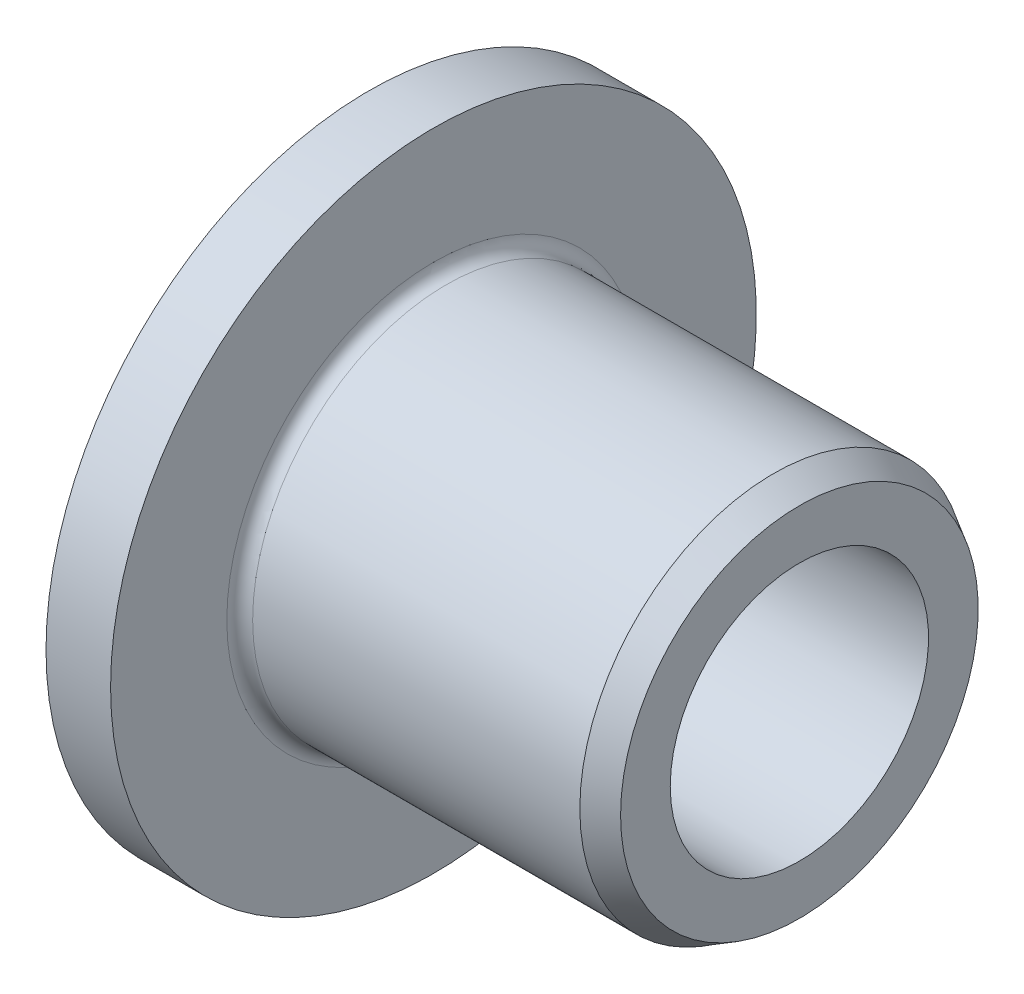
ISO-10303-21;
HEADER;
FILE_DESCRIPTION(('STEP AP214'),'2;1');
FILE_NAME('part.step','',(''),(''),'','','');
FILE_SCHEMA(('AUTOMOTIVE_DESIGN { 1 0 10303 214 1 1 1 1 }'));
ENDSEC;
DATA;
#1=APPLICATION_CONTEXT('core data for automotive mechanical design processes');
#2=APPLICATION_PROTOCOL_DEFINITION('international standard','automotive_design',2000,#1);
#3=PRODUCT_CONTEXT('',#1,'mechanical');
#4=PRODUCT('Part','Part','',(#3));
#5=PRODUCT_RELATED_PRODUCT_CATEGORY('part','',(#4));
#6=PRODUCT_DEFINITION_FORMATION('','',#4);
#7=PRODUCT_DEFINITION_CONTEXT('part definition',#1,'design');
#8=PRODUCT_DEFINITION('design','',#6,#7);
#9=PRODUCT_DEFINITION_SHAPE('','',#8);
#10=(LENGTH_UNIT() NAMED_UNIT(*) SI_UNIT(.MILLI.,.METRE.));
#11=(NAMED_UNIT(*) PLANE_ANGLE_UNIT() SI_UNIT($,.RADIAN.));
#12=(NAMED_UNIT(*) SI_UNIT($,.STERADIAN.) SOLID_ANGLE_UNIT());
#13=UNCERTAINTY_MEASURE_WITH_UNIT(LENGTH_MEASURE(1.E-05),#10,'distance_accuracy_value','');
#14=(GEOMETRIC_REPRESENTATION_CONTEXT(3) GLOBAL_UNCERTAINTY_ASSIGNED_CONTEXT((#13)) GLOBAL_UNIT_ASSIGNED_CONTEXT((#10,
#11,#12)) REPRESENTATION_CONTEXT('',''));
#15=CARTESIAN_POINT('',(0.,0.,0.));
#16=DIRECTION('',(0.,0.,1.));
#17=DIRECTION('',(1.,0.,0.));
#18=AXIS2_PLACEMENT_3D('',#15,#16,#17);
#19=CARTESIAN_POINT('',(-1.6,0.,0.));
#20=DIRECTION('',(-1.,0.,0.));
#21=DIRECTION('',(0.,0.,1.));
#22=AXIS2_PLACEMENT_3D('',#19,#20,#21);
#23=TOROIDAL_SURFACE('',#22,2.4,0.150000000000001);
#24=CARTESIAN_POINT('',(-1.75,0.,0.));
#25=DIRECTION('',(-1.,0.,0.));
#26=DIRECTION('',(0.,0.,1.));
#27=AXIS2_PLACEMENT_3D('',#24,#25,#26);
#28=CIRCLE('',#27,2.4);
#29=CARTESIAN_POINT('',(-1.75,0.,2.4));
#30=VERTEX_POINT('',#29);
#31=EDGE_CURVE('E10',#30,#30,#28,.T.);
#32=ORIENTED_EDGE('',*,*,#31,.F.);
#33=EDGE_LOOP('',(#32));
#34=FACE_BOUND('',#33,.T.);
#35=CARTESIAN_POINT('',(-1.6,0.,0.));
#36=DIRECTION('',(-1.,0.,0.));
#37=DIRECTION('',(0.,0.,1.));
#38=AXIS2_PLACEMENT_3D('',#35,#36,#37);
#39=CIRCLE('',#38,2.25);
#40=CARTESIAN_POINT('',(-1.6,0.,2.25));
#41=VERTEX_POINT('',#40);
#42=EDGE_CURVE('E63',#41,#41,#39,.T.);
#43=ORIENTED_EDGE('',*,*,#42,.T.);
#44=EDGE_LOOP('',(#43));
#45=FACE_BOUND('',#44,.T.);
#46=ADVANCED_FACE('F35',(#34,#45),#23,.F.);
#47=CARTESIAN_POINT('',(-1.75,3.75,0.));
#48=DIRECTION('',(-1.,0.,0.));
#49=DIRECTION('',(0.,0.,1.));
#50=AXIS2_PLACEMENT_3D('',#47,#48,#49);
#51=PLANE('',#50);
#52=CARTESIAN_POINT('',(-1.75,0.,0.));
#53=DIRECTION('',(-1.,0.,0.));
#54=DIRECTION('',(0.,0.,1.));
#55=AXIS2_PLACEMENT_3D('',#52,#53,#54);
#56=CIRCLE('',#55,3.75);
#57=CARTESIAN_POINT('',(-1.75,0.,3.75));
#58=VERTEX_POINT('',#57);
#59=EDGE_CURVE('E41',#58,#58,#56,.T.);
#60=ORIENTED_EDGE('',*,*,#59,.F.);
#61=EDGE_LOOP('',(#60));
#62=FACE_BOUND('',#61,.T.);
#63=ORIENTED_EDGE('',*,*,#31,.T.);
#64=EDGE_LOOP('',(#63));
#65=FACE_BOUND('',#64,.T.);
#66=ADVANCED_FACE('F100',(#62,#65),#51,.F.);
#67=CARTESIAN_POINT('',(-2.5,0.,0.));
#68=DIRECTION('',(-1.,0.,0.));
#69=DIRECTION('',(0.,0.,1.));
#70=AXIS2_PLACEMENT_3D('',#67,#68,#69);
#71=CYLINDRICAL_SURFACE('',#70,3.75);
#72=CARTESIAN_POINT('',(-2.5,0.,0.));
#73=DIRECTION('',(-1.,0.,0.));
#74=DIRECTION('',(0.,0.,1.));
#75=AXIS2_PLACEMENT_3D('',#72,#73,#74);
#76=CIRCLE('',#75,3.75);
#77=CARTESIAN_POINT('',(-2.5,0.,3.75));
#78=VERTEX_POINT('',#77);
#79=EDGE_CURVE('E45',#78,#78,#76,.T.);
#80=ORIENTED_EDGE('',*,*,#79,.F.);
#81=EDGE_LOOP('',(#80));
#82=FACE_BOUND('',#81,.T.);
#83=ORIENTED_EDGE('',*,*,#59,.T.);
#84=EDGE_LOOP('',(#83));
#85=FACE_BOUND('',#84,.T.);
#86=ADVANCED_FACE('F95',(#82,#85),#71,.T.);
#87=CARTESIAN_POINT('',(-2.5,1.5,0.));
#88=DIRECTION('',(1.,0.,0.));
#89=DIRECTION('',(0.,0.,-1.));
#90=AXIS2_PLACEMENT_3D('',#87,#88,#89);
#91=PLANE('',#90);
#92=CARTESIAN_POINT('',(-2.5,0.,0.));
#93=DIRECTION('',(-1.,0.,0.));
#94=DIRECTION('',(0.,0.,1.));
#95=AXIS2_PLACEMENT_3D('',#92,#93,#94);
#96=CIRCLE('',#95,1.5);
#97=CARTESIAN_POINT('',(-2.5,0.,1.5));
#98=VERTEX_POINT('',#97);
#99=EDGE_CURVE('E49',#98,#98,#96,.T.);
#100=ORIENTED_EDGE('',*,*,#99,.F.);
#101=EDGE_LOOP('',(#100));
#102=FACE_BOUND('',#101,.T.);
#103=ORIENTED_EDGE('',*,*,#79,.T.);
#104=EDGE_LOOP('',(#103));
#105=FACE_BOUND('',#104,.T.);
#106=ADVANCED_FACE('F89',(#102,#105),#91,.F.);
#107=CARTESIAN_POINT('',(-2.5,0.,0.));
#108=DIRECTION('',(-1.,0.,0.));
#109=DIRECTION('',(0.,0.,1.));
#110=AXIS2_PLACEMENT_3D('',#107,#108,#109);
#111=CYLINDRICAL_SURFACE('',#110,1.5);
#112=CARTESIAN_POINT('',(2.5,0.,0.));
#113=DIRECTION('',(-1.,0.,0.));
#114=DIRECTION('',(0.,0.,1.));
#115=AXIS2_PLACEMENT_3D('',#112,#113,#114);
#116=CIRCLE('',#115,1.5);
#117=CARTESIAN_POINT('',(2.5,0.,1.5));
#118=VERTEX_POINT('',#117);
#119=EDGE_CURVE('E54',#118,#118,#116,.T.);
#120=ORIENTED_EDGE('',*,*,#119,.F.);
#121=EDGE_LOOP('',(#120));
#122=FACE_BOUND('',#121,.T.);
#123=ORIENTED_EDGE('',*,*,#99,.T.);
#124=EDGE_LOOP('',(#123));
#125=FACE_BOUND('',#124,.T.);
#126=ADVANCED_FACE('F83',(#122,#125),#111,.F.);
#127=CARTESIAN_POINT('',(2.5,2.07679491924311,0.));
#128=DIRECTION('',(-1.,0.,0.));
#129=DIRECTION('',(0.,0.,1.));
#130=AXIS2_PLACEMENT_3D('',#127,#128,#129);
#131=PLANE('',#130);
#132=CARTESIAN_POINT('',(2.5,0.,0.));
#133=DIRECTION('',(-1.,0.,0.));
#134=DIRECTION('',(0.,0.,1.));
#135=AXIS2_PLACEMENT_3D('',#132,#133,#134);
#136=CIRCLE('',#135,2.07679491924311);
#137=CARTESIAN_POINT('',(2.5,0.,2.07679491924311));
#138=VERTEX_POINT('',#137);
#139=EDGE_CURVE('E57',#138,#138,#136,.T.);
#140=ORIENTED_EDGE('',*,*,#139,.F.);
#141=EDGE_LOOP('',(#140));
#142=FACE_BOUND('',#141,.T.);
#143=ORIENTED_EDGE('',*,*,#119,.T.);
#144=EDGE_LOOP('',(#143));
#145=FACE_BOUND('',#144,.T.);
#146=ADVANCED_FACE('F77',(#142,#145),#131,.F.);
#147=CARTESIAN_POINT('',(2.5,0.,0.));
#148=DIRECTION('',(-1.,0.,0.));
#149=DIRECTION('',(0.,0.,1.));
#150=AXIS2_PLACEMENT_3D('',#147,#148,#149);
#151=CONICAL_SURFACE('',#150,2.07679491924311,0.523598775598298);
#152=CARTESIAN_POINT('',(2.2,0.,0.));
#153=DIRECTION('',(-1.,0.,0.));
#154=DIRECTION('',(0.,0.,1.));
#155=AXIS2_PLACEMENT_3D('',#152,#153,#154);
#156=CIRCLE('',#155,2.25);
#157=CARTESIAN_POINT('',(2.2,0.,2.25));
#158=VERTEX_POINT('',#157);
#159=EDGE_CURVE('E60',#158,#158,#156,.T.);
#160=ORIENTED_EDGE('',*,*,#159,.F.);
#161=EDGE_LOOP('',(#160));
#162=FACE_BOUND('',#161,.T.);
#163=ORIENTED_EDGE('',*,*,#139,.T.);
#164=EDGE_LOOP('',(#163));
#165=FACE_BOUND('',#164,.T.);
#166=ADVANCED_FACE('F71',(#162,#165),#151,.T.);
#167=CARTESIAN_POINT('',(-2.5,0.,0.));
#168=DIRECTION('',(-1.,0.,0.));
#169=DIRECTION('',(0.,0.,1.));
#170=AXIS2_PLACEMENT_3D('',#167,#168,#169);
#171=CYLINDRICAL_SURFACE('',#170,2.25);
#172=ORIENTED_EDGE('',*,*,#42,.F.);
#173=EDGE_LOOP('',(#172));
#174=FACE_BOUND('',#173,.T.);
#175=ORIENTED_EDGE('',*,*,#159,.T.);
#176=EDGE_LOOP('',(#175));
#177=FACE_BOUND('',#176,.T.);
#178=ADVANCED_FACE('F68',(#174,#177),#171,.T.);
#179=CLOSED_SHELL('',(#46,#66,#86,#106,#126,#146,#166,#178));
#180=MANIFOLD_SOLID_BREP('B2',#179);
#181=ADVANCED_BREP_SHAPE_REPRESENTATION('',(#18,#180),#14);
#182=SHAPE_DEFINITION_REPRESENTATION(#9,#181);
ENDSEC;
END-ISO-10303-21;
